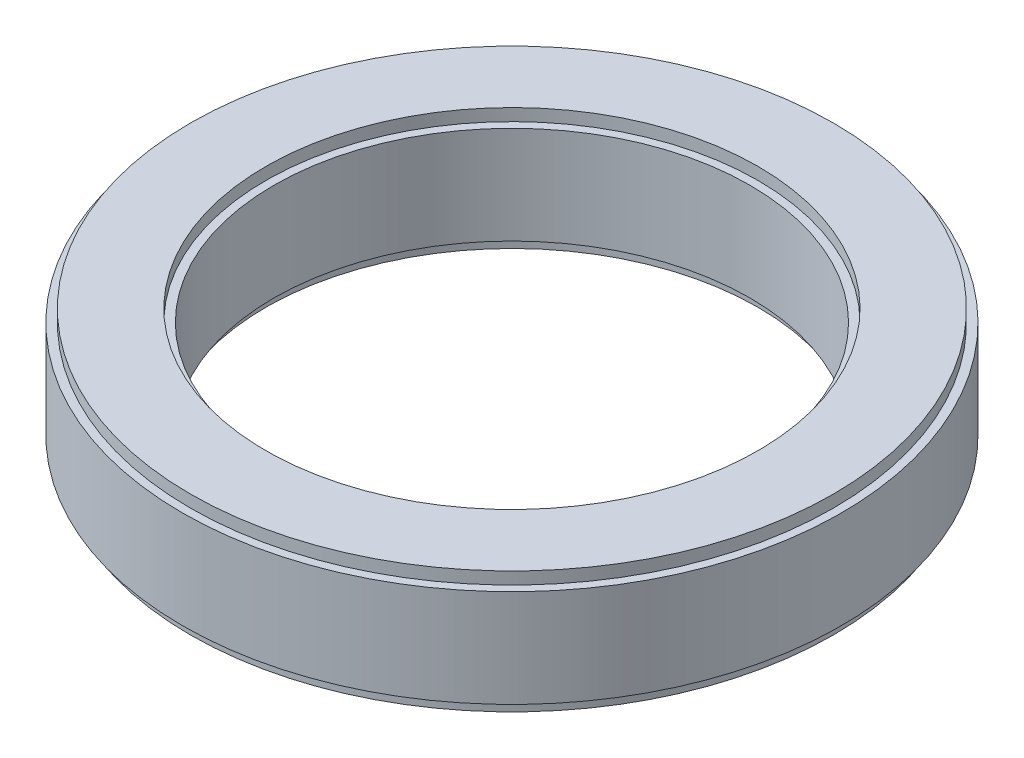
ISO-10303-21;
HEADER;
FILE_DESCRIPTION(('STEP AP214'),'2;1');
FILE_NAME('part.step','',(''),(''),'','','');
FILE_SCHEMA(('AUTOMOTIVE_DESIGN { 1 0 10303 214 1 1 1 1 }'));
ENDSEC;
DATA;
#1=APPLICATION_CONTEXT('core data for automotive mechanical design processes');
#2=APPLICATION_PROTOCOL_DEFINITION('international standard','automotive_design',2000,#1);
#3=PRODUCT_CONTEXT('',#1,'mechanical');
#4=PRODUCT('Part','Part','',(#3));
#5=PRODUCT_RELATED_PRODUCT_CATEGORY('part','',(#4));
#6=PRODUCT_DEFINITION_FORMATION('','',#4);
#7=PRODUCT_DEFINITION_CONTEXT('part definition',#1,'design');
#8=PRODUCT_DEFINITION('design','',#6,#7);
#9=PRODUCT_DEFINITION_SHAPE('','',#8);
#10=(LENGTH_UNIT() NAMED_UNIT(*) SI_UNIT(.MILLI.,.METRE.));
#11=(NAMED_UNIT(*) PLANE_ANGLE_UNIT() SI_UNIT($,.RADIAN.));
#12=(NAMED_UNIT(*) SI_UNIT($,.STERADIAN.) SOLID_ANGLE_UNIT());
#13=UNCERTAINTY_MEASURE_WITH_UNIT(LENGTH_MEASURE(1.E-05),#10,'distance_accuracy_value','');
#14=(GEOMETRIC_REPRESENTATION_CONTEXT(3) GLOBAL_UNCERTAINTY_ASSIGNED_CONTEXT((#13)) GLOBAL_UNIT_ASSIGNED_CONTEXT((#10,
#11,#12)) REPRESENTATION_CONTEXT('',''));
#15=CARTESIAN_POINT('',(0.,0.,0.));
#16=DIRECTION('',(0.,0.,1.));
#17=DIRECTION('',(1.,0.,0.));
#18=AXIS2_PLACEMENT_3D('',#15,#16,#17);
#19=CARTESIAN_POINT('',(-39.5,-7.5,0.));
#20=DIRECTION('',(0.,1.,0.));
#21=DIRECTION('',(0.,0.,1.));
#22=AXIS2_PLACEMENT_3D('',#19,#20,#21);
#23=PLANE('',#22);
#24=CARTESIAN_POINT('',(0.,-7.5,0.));
#25=DIRECTION('',(0.,-1.,0.));
#26=DIRECTION('',(0.,0.,-1.));
#27=AXIS2_PLACEMENT_3D('',#24,#25,#26);
#28=CIRCLE('',#27,39.5);
#29=CARTESIAN_POINT('',(0.,-7.5,-39.5));
#30=VERTEX_POINT('',#29);
#31=EDGE_CURVE('E17',#30,#30,#28,.F.);
#32=ORIENTED_EDGE('',*,*,#31,.F.);
#33=EDGE_LOOP('',(#32));
#34=FACE_BOUND('',#33,.T.);
#35=CARTESIAN_POINT('',(0.,-7.5,0.));
#36=DIRECTION('',(0.,-1.,0.));
#37=DIRECTION('',(0.,0.,-1.));
#38=AXIS2_PLACEMENT_3D('',#35,#36,#37);
#39=CIRCLE('',#38,30.25);
#40=CARTESIAN_POINT('',(0.,-7.5,-30.25));
#41=VERTEX_POINT('',#40);
#42=EDGE_CURVE('E51',#41,#41,#39,.F.);
#43=ORIENTED_EDGE('',*,*,#42,.T.);
#44=EDGE_LOOP('',(#43));
#45=FACE_BOUND('',#44,.T.);
#46=ADVANCED_FACE('F14',(#34,#45),#23,.F.);
#47=CARTESIAN_POINT('',(0.,0.,0.));
#48=DIRECTION('',(0.,-1.,0.));
#49=DIRECTION('',(0.,0.,-1.));
#50=AXIS2_PLACEMENT_3D('',#47,#48,#49);
#51=CYLINDRICAL_SURFACE('',#50,39.5);
#52=ORIENTED_EDGE('',*,*,#31,.T.);
#53=EDGE_LOOP('',(#52));
#54=FACE_BOUND('',#53,.T.);
#55=CARTESIAN_POINT('',(0.,-6.,0.));
#56=DIRECTION('',(0.,-1.,0.));
#57=DIRECTION('',(0.,0.,-1.));
#58=AXIS2_PLACEMENT_3D('',#55,#56,#57);
#59=CIRCLE('',#58,39.5);
#60=CARTESIAN_POINT('',(0.,-6.,-39.5));
#61=VERTEX_POINT('',#60);
#62=EDGE_CURVE('E49',#61,#61,#59,.F.);
#63=ORIENTED_EDGE('',*,*,#62,.F.);
#64=EDGE_LOOP('',(#63));
#65=FACE_BOUND('',#64,.T.);
#66=ADVANCED_FACE('F58',(#54,#65),#51,.T.);
#67=CARTESIAN_POINT('',(0.,0.,0.));
#68=DIRECTION('',(0.,-1.,0.));
#69=DIRECTION('',(0.,0.,-1.));
#70=AXIS2_PLACEMENT_3D('',#67,#68,#69);
#71=CYLINDRICAL_SURFACE('',#70,30.25);
#72=ORIENTED_EDGE('',*,*,#42,.F.);
#73=EDGE_LOOP('',(#72));
#74=FACE_BOUND('',#73,.T.);
#75=CARTESIAN_POINT('',(0.,-6.,0.));
#76=DIRECTION('',(0.,-1.,0.));
#77=DIRECTION('',(0.,0.,-1.));
#78=AXIS2_PLACEMENT_3D('',#75,#76,#77);
#79=CIRCLE('',#78,30.25);
#80=CARTESIAN_POINT('',(0.,-6.,-30.25));
#81=VERTEX_POINT('',#80);
#82=EDGE_CURVE('E46',#81,#81,#79,.T.);
#83=ORIENTED_EDGE('',*,*,#82,.F.);
#84=EDGE_LOOP('',(#83));
#85=FACE_BOUND('',#84,.T.);
#86=ADVANCED_FACE('F66',(#74,#85),#71,.F.);
#87=CARTESIAN_POINT('',(-40.5,-6.,0.));
#88=DIRECTION('',(0.,-1.,0.));
#89=DIRECTION('',(0.,0.,-1.));
#90=AXIS2_PLACEMENT_3D('',#87,#88,#89);
#91=PLANE('',#90);
#92=ORIENTED_EDGE('',*,*,#62,.T.);
#93=EDGE_LOOP('',(#92));
#94=FACE_BOUND('',#93,.T.);
#95=CARTESIAN_POINT('',(0.,-6.,0.));
#96=DIRECTION('',(0.,1.,0.));
#97=DIRECTION('',(0.,0.,1.));
#98=AXIS2_PLACEMENT_3D('',#95,#96,#97);
#99=CIRCLE('',#98,40.5);
#100=CARTESIAN_POINT('',(0.,-6.,40.5));
#101=VERTEX_POINT('',#100);
#102=EDGE_CURVE('E43',#101,#101,#99,.T.);
#103=ORIENTED_EDGE('',*,*,#102,.F.);
#104=EDGE_LOOP('',(#103));
#105=FACE_BOUND('',#104,.T.);
#106=ADVANCED_FACE('F101',(#94,#105),#91,.T.);
#107=CARTESIAN_POINT('',(-40.5,-6.,0.));
#108=DIRECTION('',(0.,-1.,0.));
#109=DIRECTION('',(0.,0.,-1.));
#110=AXIS2_PLACEMENT_3D('',#107,#108,#109);
#111=PLANE('',#110);
#112=ORIENTED_EDGE('',*,*,#82,.T.);
#113=EDGE_LOOP('',(#112));
#114=FACE_BOUND('',#113,.T.);
#115=CARTESIAN_POINT('',(0.,-6.,0.));
#116=DIRECTION('',(0.,1.,0.));
#117=DIRECTION('',(0.,0.,1.));
#118=AXIS2_PLACEMENT_3D('',#115,#116,#117);
#119=CIRCLE('',#118,29.25);
#120=CARTESIAN_POINT('',(0.,-6.,29.25));
#121=VERTEX_POINT('',#120);
#122=EDGE_CURVE('E40',#121,#121,#119,.T.);
#123=ORIENTED_EDGE('',*,*,#122,.T.);
#124=EDGE_LOOP('',(#123));
#125=FACE_BOUND('',#124,.T.);
#126=ADVANCED_FACE('F97',(#114,#125),#111,.T.);
#127=CARTESIAN_POINT('',(0.,0.,0.));
#128=DIRECTION('',(0.,1.,0.));
#129=DIRECTION('',(0.,0.,1.));
#130=AXIS2_PLACEMENT_3D('',#127,#128,#129);
#131=CYLINDRICAL_SURFACE('',#130,40.5);
#132=ORIENTED_EDGE('',*,*,#102,.T.);
#133=EDGE_LOOP('',(#132));
#134=FACE_BOUND('',#133,.T.);
#135=CARTESIAN_POINT('',(0.,6.,0.));
#136=DIRECTION('',(0.,1.,0.));
#137=DIRECTION('',(0.,0.,1.));
#138=AXIS2_PLACEMENT_3D('',#135,#136,#137);
#139=CIRCLE('',#138,40.5);
#140=CARTESIAN_POINT('',(0.,6.,40.5));
#141=VERTEX_POINT('',#140);
#142=EDGE_CURVE('E37',#141,#141,#139,.T.);
#143=ORIENTED_EDGE('',*,*,#142,.F.);
#144=EDGE_LOOP('',(#143));
#145=FACE_BOUND('',#144,.T.);
#146=ADVANCED_FACE('F93',(#134,#145),#131,.T.);
#147=CARTESIAN_POINT('',(0.,0.,0.));
#148=DIRECTION('',(0.,1.,0.));
#149=DIRECTION('',(0.,0.,1.));
#150=AXIS2_PLACEMENT_3D('',#147,#148,#149);
#151=CYLINDRICAL_SURFACE('',#150,29.25);
#152=CARTESIAN_POINT('',(0.,6.,0.));
#153=DIRECTION('',(0.,1.,0.));
#154=DIRECTION('',(0.,0.,1.));
#155=AXIS2_PLACEMENT_3D('',#152,#153,#154);
#156=CIRCLE('',#155,29.25);
#157=CARTESIAN_POINT('',(0.,6.,29.25));
#158=VERTEX_POINT('',#157);
#159=EDGE_CURVE('E34',#158,#158,#156,.F.);
#160=ORIENTED_EDGE('',*,*,#159,.F.);
#161=EDGE_LOOP('',(#160));
#162=FACE_BOUND('',#161,.T.);
#163=ORIENTED_EDGE('',*,*,#122,.F.);
#164=EDGE_LOOP('',(#163));
#165=FACE_BOUND('',#164,.T.);
#166=ADVANCED_FACE('F89',(#162,#165),#151,.F.);
#167=CARTESIAN_POINT('',(-40.5,6.,0.));
#168=DIRECTION('',(0.,1.,0.));
#169=DIRECTION('',(0.,0.,1.));
#170=AXIS2_PLACEMENT_3D('',#167,#168,#169);
#171=PLANE('',#170);
#172=CARTESIAN_POINT('',(0.,6.,0.));
#173=DIRECTION('',(0.,-1.,0.));
#174=DIRECTION('',(0.,0.,-1.));
#175=AXIS2_PLACEMENT_3D('',#172,#173,#174);
#176=CIRCLE('',#175,39.5);
#177=CARTESIAN_POINT('',(0.,6.,-39.5));
#178=VERTEX_POINT('',#177);
#179=EDGE_CURVE('E31',#178,#178,#176,.F.);
#180=ORIENTED_EDGE('',*,*,#179,.F.);
#181=EDGE_LOOP('',(#180));
#182=FACE_BOUND('',#181,.T.);
#183=ORIENTED_EDGE('',*,*,#142,.T.);
#184=EDGE_LOOP('',(#183));
#185=FACE_BOUND('',#184,.T.);
#186=ADVANCED_FACE('F85',(#182,#185),#171,.T.);
#187=CARTESIAN_POINT('',(-40.5,6.,0.));
#188=DIRECTION('',(0.,1.,0.));
#189=DIRECTION('',(0.,0.,1.));
#190=AXIS2_PLACEMENT_3D('',#187,#188,#189);
#191=PLANE('',#190);
#192=CARTESIAN_POINT('',(0.,6.,0.));
#193=DIRECTION('',(0.,-1.,0.));
#194=DIRECTION('',(0.,0.,-1.));
#195=AXIS2_PLACEMENT_3D('',#192,#193,#194);
#196=CIRCLE('',#195,30.25);
#197=CARTESIAN_POINT('',(0.,6.,-30.25));
#198=VERTEX_POINT('',#197);
#199=EDGE_CURVE('E26',#198,#198,#196,.F.);
#200=ORIENTED_EDGE('',*,*,#199,.T.);
#201=EDGE_LOOP('',(#200));
#202=FACE_BOUND('',#201,.T.);
#203=ORIENTED_EDGE('',*,*,#159,.T.);
#204=EDGE_LOOP('',(#203));
#205=FACE_BOUND('',#204,.T.);
#206=ADVANCED_FACE('F81',(#202,#205),#191,.T.);
#207=CARTESIAN_POINT('',(0.,0.,0.));
#208=DIRECTION('',(0.,-1.,0.));
#209=DIRECTION('',(0.,0.,-1.));
#210=AXIS2_PLACEMENT_3D('',#207,#208,#209);
#211=CYLINDRICAL_SURFACE('',#210,39.5);
#212=ORIENTED_EDGE('',*,*,#179,.T.);
#213=EDGE_LOOP('',(#212));
#214=FACE_BOUND('',#213,.T.);
#215=CARTESIAN_POINT('',(0.,7.5,0.));
#216=DIRECTION('',(0.,-1.,0.));
#217=DIRECTION('',(0.,0.,-1.));
#218=AXIS2_PLACEMENT_3D('',#215,#216,#217);
#219=CIRCLE('',#218,39.5);
#220=CARTESIAN_POINT('',(0.,7.5,-39.5));
#221=VERTEX_POINT('',#220);
#222=EDGE_CURVE('E21',#221,#221,#219,.T.);
#223=ORIENTED_EDGE('',*,*,#222,.T.);
#224=EDGE_LOOP('',(#223));
#225=FACE_BOUND('',#224,.T.);
#226=ADVANCED_FACE('F75',(#214,#225),#211,.T.);
#227=CARTESIAN_POINT('',(0.,0.,0.));
#228=DIRECTION('',(0.,-1.,0.));
#229=DIRECTION('',(0.,0.,-1.));
#230=AXIS2_PLACEMENT_3D('',#227,#228,#229);
#231=CYLINDRICAL_SURFACE('',#230,30.25);
#232=CARTESIAN_POINT('',(0.,7.5,0.));
#233=DIRECTION('',(0.,-1.,0.));
#234=DIRECTION('',(0.,0.,-1.));
#235=AXIS2_PLACEMENT_3D('',#232,#233,#234);
#236=CIRCLE('',#235,30.25);
#237=CARTESIAN_POINT('',(0.,7.5,-30.25));
#238=VERTEX_POINT('',#237);
#239=EDGE_CURVE('E10',#238,#238,#236,.F.);
#240=ORIENTED_EDGE('',*,*,#239,.T.);
#241=EDGE_LOOP('',(#240));
#242=FACE_BOUND('',#241,.T.);
#243=ORIENTED_EDGE('',*,*,#199,.F.);
#244=EDGE_LOOP('',(#243));
#245=FACE_BOUND('',#244,.T.);
#246=ADVANCED_FACE('F69',(#242,#245),#231,.F.);
#247=CARTESIAN_POINT('',(-39.5,7.5,0.));
#248=DIRECTION('',(0.,-1.,0.));
#249=DIRECTION('',(0.,0.,-1.));
#250=AXIS2_PLACEMENT_3D('',#247,#248,#249);
#251=PLANE('',#250);
#252=ORIENTED_EDGE('',*,*,#239,.F.);
#253=EDGE_LOOP('',(#252));
#254=FACE_BOUND('',#253,.T.);
#255=ORIENTED_EDGE('',*,*,#222,.F.);
#256=EDGE_LOOP('',(#255));
#257=FACE_BOUND('',#256,.T.);
#258=ADVANCED_FACE('F67',(#254,#257),#251,.F.);
#259=CLOSED_SHELL('',(#46,#66,#86,#106,#126,#146,#166,#186,#206,#226,#246,#258));
#260=MANIFOLD_SOLID_BREP('B1',#259);
#261=ADVANCED_BREP_SHAPE_REPRESENTATION('',(#18,#260),#14);
#262=SHAPE_DEFINITION_REPRESENTATION(#9,#261);
ENDSEC;
END-ISO-10303-21;
